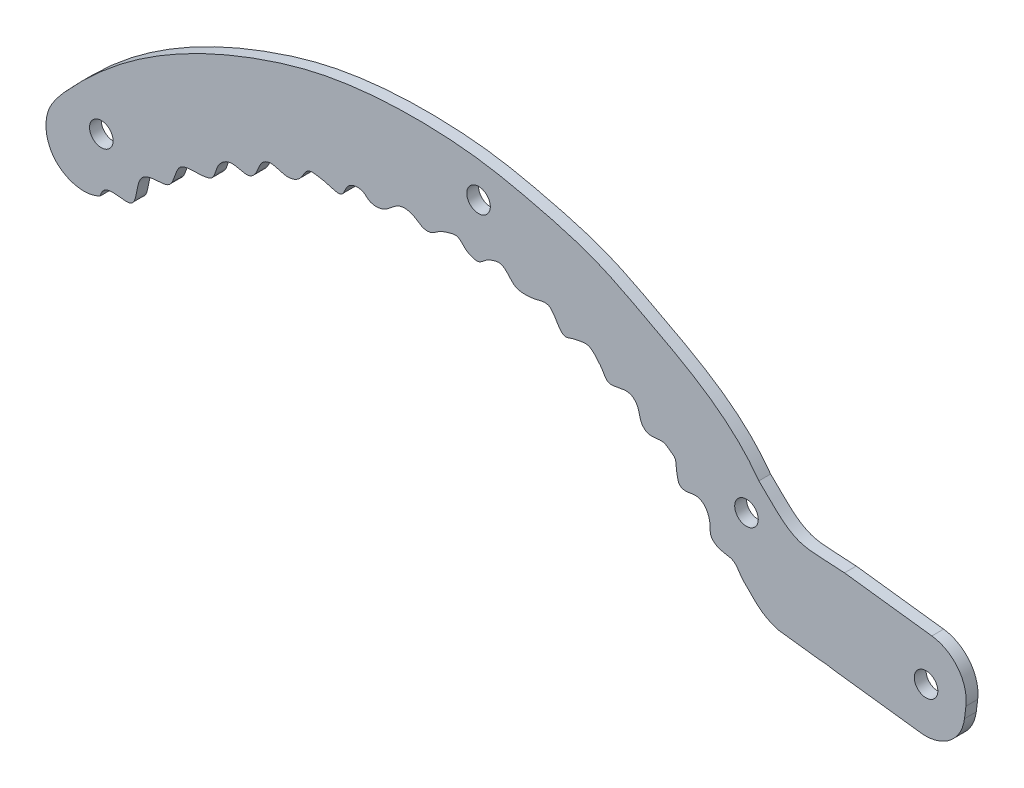
ISO-10303-21;
HEADER;
FILE_DESCRIPTION(('STEP AP214'),'2;1');
FILE_NAME('part.step','',(''),(''),'','','');
FILE_SCHEMA(('AUTOMOTIVE_DESIGN { 1 0 10303 214 1 1 1 1 }'));
ENDSEC;
DATA;
#1=APPLICATION_CONTEXT('core data for automotive mechanical design processes');
#2=APPLICATION_PROTOCOL_DEFINITION('international standard','automotive_design',2000,#1);
#3=PRODUCT_CONTEXT('',#1,'mechanical');
#4=PRODUCT('Part','Part','',(#3));
#5=PRODUCT_RELATED_PRODUCT_CATEGORY('part','',(#4));
#6=PRODUCT_DEFINITION_FORMATION('','',#4);
#7=PRODUCT_DEFINITION_CONTEXT('part definition',#1,'design');
#8=PRODUCT_DEFINITION('design','',#6,#7);
#9=PRODUCT_DEFINITION_SHAPE('','',#8);
#10=(LENGTH_UNIT() NAMED_UNIT(*) SI_UNIT(.MILLI.,.METRE.));
#11=(NAMED_UNIT(*) PLANE_ANGLE_UNIT() SI_UNIT($,.RADIAN.));
#12=(NAMED_UNIT(*) SI_UNIT($,.STERADIAN.) SOLID_ANGLE_UNIT());
#13=UNCERTAINTY_MEASURE_WITH_UNIT(LENGTH_MEASURE(1.E-05),#10,'distance_accuracy_value','');
#14=(GEOMETRIC_REPRESENTATION_CONTEXT(3) GLOBAL_UNCERTAINTY_ASSIGNED_CONTEXT((#13)) GLOBAL_UNIT_ASSIGNED_CONTEXT((#10,
#11,#12)) REPRESENTATION_CONTEXT('',''));
#15=CARTESIAN_POINT('',(0.,0.,0.));
#16=DIRECTION('',(0.,0.,1.));
#17=DIRECTION('',(1.,0.,0.));
#18=AXIS2_PLACEMENT_3D('',#15,#16,#17);
#19=CARTESIAN_POINT('',(0.0998833490836737,-0.584575880557825,1.5));
#20=DIRECTION('',(0.,0.,1.));
#21=DIRECTION('',(1.,0.,0.));
#22=AXIS2_PLACEMENT_3D('',#19,#20,#21);
#23=PLANE('',#22);
#24=CARTESIAN_POINT('',(0.167304742514029,0.145501945602866,1.5));
#25=DIRECTION('',(0.,0.,1.));
#26=DIRECTION('',(1.,0.,0.));
#27=AXIS2_PLACEMENT_3D('',#24,#25,#26);
#28=CIRCLE('',#27,1.50000000000011);
#29=CARTESIAN_POINT('',(1.66730474251414,0.145501945602866,1.5));
#30=VERTEX_POINT('',#29);
#31=EDGE_CURVE('E257',#30,#30,#28,.T.);
#32=ORIENTED_EDGE('',*,*,#31,.F.);
#33=EDGE_LOOP('',(#32));
#34=FACE_BOUND('',#33,.T.);
#35=CARTESIAN_POINT('',(-104.906076676747,8.31156840031277,1.5));
#36=DIRECTION('',(0.,0.,1.));
#37=DIRECTION('',(1.,0.,0.));
#38=AXIS2_PLACEMENT_3D('',#35,#36,#37);
#39=CIRCLE('',#38,1.5);
#40=CARTESIAN_POINT('',(-103.406076676747,8.31156840031277,1.5));
#41=VERTEX_POINT('',#40);
#42=EDGE_CURVE('E249',#41,#41,#39,.T.);
#43=ORIENTED_EDGE('',*,*,#42,.F.);
#44=EDGE_LOOP('',(#43));
#45=FACE_BOUND('',#44,.T.);
#46=CARTESIAN_POINT('',(0.0998833490836737,-0.584575880557825,1.5));
#47=DIRECTION('',(0.,0.,1.));
#48=DIRECTION('',(1.,0.,0.));
#49=AXIS2_PLACEMENT_3D('',#46,#47,#48);
#50=CIRCLE('',#49,4.99999999999996);
#51=CARTESIAN_POINT('',(-0.520900423310055,-5.54588896359664,1.5));
#52=VERTEX_POINT('',#51);
#53=CARTESIAN_POINT('',(5.06119643212249,-1.20535965295171,1.5));
#54=VERTEX_POINT('',#53);
#55=EDGE_CURVE('E244',#52,#54,#50,.T.);
#56=ORIENTED_EDGE('',*,*,#55,.T.);
#57=DIRECTION('',(0.124156754478779,0.992262616607769,0.));
#58=VECTOR('',#57,1.);
#59=CARTESIAN_POINT('',(5.24548290276533,0.267460543848186,1.5));
#60=LINE('',#59,#58);
#61=CARTESIAN_POINT('',(5.24548290276529,0.26746054384819,1.5));
#62=VERTEX_POINT('',#61);
#63=EDGE_CURVE('E109',#54,#62,#60,.T.);
#64=ORIENTED_EDGE('',*,*,#63,.T.);
#65=CARTESIAN_POINT('',(0.28416981972651,0.888244316242071,1.5));
#66=DIRECTION('',(0.,0.,1.));
#67=DIRECTION('',(1.,0.,0.));
#68=AXIS2_PLACEMENT_3D('',#65,#66,#67);
#69=CIRCLE('',#68,4.99999999999994);
#70=CARTESIAN_POINT('',(0.904953592120313,5.84955739928082,1.5));
#71=VERTEX_POINT('',#70);
#72=EDGE_CURVE('E241',#62,#71,#69,.T.);
#73=ORIENTED_EDGE('',*,*,#72,.T.);
#74=DIRECTION('',(-0.992262616607771,0.124156754478763,0.));
#75=VECTOR('',#74,1.);
#76=CARTESIAN_POINT('',(-10.2280218707566,7.24256977123525,1.5));
#77=LINE('',#76,#75);
#78=CARTESIAN_POINT('',(-10.2280218707566,7.24256977123525,1.5));
#79=VERTEX_POINT('',#78);
#80=EDGE_CURVE('E236',#71,#79,#77,.T.);
#81=ORIENTED_EDGE('',*,*,#80,.T.);
#82=CARTESIAN_POINT('',(-10.2280218707566,7.24256977123525,1.5));
#83=CARTESIAN_POINT('',(-10.9118560941422,7.28099631081727,1.5));
#84=CARTESIAN_POINT('',(-12.8351292385516,7.45598323970137,1.5));
#85=CARTESIAN_POINT('',(-17.1579812525324,7.41320448844757,1.5));
#86=CARTESIAN_POINT('',(-19.6512095664311,10.6162494281615,1.5));
#87=CARTESIAN_POINT('',(-21.1308451157724,11.9335614122551,1.5));
#88=B_SPLINE_CURVE_WITH_KNOTS('',3,(#82,#83,#84,#85,#86,#87),.UNSPECIFIED.,.F.,.F.,(4,1,1,4),
(0.763961689474748,0.803221291532483,0.875531472054988,1.),.UNSPECIFIED.);
#89=CARTESIAN_POINT('',(-21.1308451157724,11.9335614122551,1.5));
#90=VERTEX_POINT('',#89);
#91=EDGE_CURVE('E228',#79,#90,#88,.T.);
#92=ORIENTED_EDGE('',*,*,#91,.T.);
#93=CARTESIAN_POINT('',(-21.1308451157724,11.9335614122551,1.5));
#94=CARTESIAN_POINT('',(-24.8609025909508,17.1629284677813,1.5));
#95=CARTESIAN_POINT('',(-32.1642526822957,20.8937409379163,1.5));
#96=CARTESIAN_POINT('',(-42.137002014777,26.2165933973467,1.5));
#97=CARTESIAN_POINT('',(-49.0452055041722,28.0556629414949,1.5));
#98=CARTESIAN_POINT('',(-55.8035266419385,29.535441398283,1.5));
#99=CARTESIAN_POINT('',(-61.9486021471023,30.1048022388868,1.5));
#100=CARTESIAN_POINT('',(-69.5291101922665,30.1082909351504,1.5));
#101=CARTESIAN_POINT('',(-77.0729402385325,29.0917441837769,1.5));
#102=CARTESIAN_POINT('',(-83.8842916647882,27.0298701290858,1.5));
#103=CARTESIAN_POINT('',(-91.4088722325952,24.1708837791464,1.5));
#104=CARTESIAN_POINT('',(-100.536470974001,19.2605370321017,1.5));
#105=CARTESIAN_POINT('',(-107.722268555437,12.8664320493643,1.5));
#106=CARTESIAN_POINT('',(-111.96420869325,7.87512578609387,1.5));
#107=CARTESIAN_POINT('',(-112.038713313323,4.67097585174367,1.5));
#108=CARTESIAN_POINT('',(-110.388332641949,1.23561784118587,1.5));
#109=CARTESIAN_POINT('',(-106.98872594061,0.360842509721987,1.5));
#110=CARTESIAN_POINT('',(-105.034557463494,1.41904876347668,1.5));
#111=B_SPLINE_CURVE_WITH_KNOTS('',3,(#93,#94,#95,#96,#97,#98,#99,#100,#101,#102,#103,#104,#105,
#106,#107,#108,#109,#110),.UNSPECIFIED.,.F.,.F.,(4,1,1,1,1,1,1,1,1,1,1,1,1,1,1,4),(0.,
0.162308773326712,0.214040794515801,0.297345887842816,0.3491544880349,0.396314502565913,
0.45953043380621,0.548645128958728,0.595484356958903,0.646703324821764,0.760819589852608,
0.864658635925295,0.902713076006373,0.926128155665857,0.944546811556018,1.),.UNSPECIFIED.);
#112=CARTESIAN_POINT('',(-105.034557463494,1.41904876347668,1.5));
#113=VERTEX_POINT('',#112);
#114=EDGE_CURVE('E224',#90,#113,#111,.T.);
#115=ORIENTED_EDGE('',*,*,#114,.T.);
#116=CARTESIAN_POINT('',(-105.034557463494,1.41904876347668,1.5));
#117=CARTESIAN_POINT('',(-104.537224229497,3.55669158626756,1.5));
#118=CARTESIAN_POINT('',(-99.9157249071784,0.726117709058255,1.5));
#119=CARTESIAN_POINT('',(-100.686268223857,6.33570510251896,1.5));
#120=CARTESIAN_POINT('',(-97.9919374373541,6.76317894457257,1.5));
#121=CARTESIAN_POINT('',(-95.6119589330189,6.78829357120356,1.5));
#122=CARTESIAN_POINT('',(-95.5062926005543,10.302247264551,1.5));
#123=CARTESIAN_POINT('',(-92.6858254937039,10.0410850872853,1.5));
#124=CARTESIAN_POINT('',(-90.471397969832,10.3471513350679,1.5));
#125=CARTESIAN_POINT('',(-90.2857166520663,12.3318084892364,1.5));
#126=CARTESIAN_POINT('',(-88.7205513522671,13.6367949271627,1.5));
#127=CARTESIAN_POINT('',(-87.1967269712032,13.2015240159715,1.5));
#128=CARTESIAN_POINT('',(-85.9730408481968,13.0037147553385,1.5));
#129=CARTESIAN_POINT('',(-84.9760945435787,13.9694421913611,1.5));
#130=CARTESIAN_POINT('',(-84.7929322359732,15.273476468758,1.5));
#131=CARTESIAN_POINT('',(-83.2755251056831,16.1679036522777,1.5));
#132=CARTESIAN_POINT('',(-82.0121374499485,15.4733792017719,1.5));
#133=CARTESIAN_POINT('',(-80.588349589733,15.4291577862662,1.5));
#134=CARTESIAN_POINT('',(-79.3284052395579,16.064966203458,1.5));
#135=CARTESIAN_POINT('',(-78.816979746935,17.6715862609035,1.5));
#136=CARTESIAN_POINT('',(-77.0777055573877,17.4724022297882,1.5));
#137=CARTESIAN_POINT('',(-75.8925888339906,17.1932627028198,1.5));
#138=CARTESIAN_POINT('',(-74.0767729989613,16.5834332082953,1.5));
#139=CARTESIAN_POINT('',(-73.6604267294814,18.884189540374,1.5));
#140=CARTESIAN_POINT('',(-71.8275442111824,18.9364550204837,1.5));
#141=CARTESIAN_POINT('',(-71.2073844669563,18.3754270748762,1.5));
#142=B_SPLINE_CURVE_WITH_KNOTS('',3,(#116,#117,#118,#119,#120,#121,#122,#123,#124,#125,#126,
#127,#128,#129,#130,#131,#132,#133,#134,#135,#136,#137,#138,#139,#140,#141),.UNSPECIFIED.,.F.,
.F.,(4,1,1,1,1,1,1,1,1,1,1,1,1,1,1,1,1,1,1,1,1,1,1,4),(0.,0.10033187251802,0.186040251980362,
0.234954160897993,0.27030048666237,0.337741821565506,0.401919809800173,0.438279807635281,
0.476829940838354,0.523229195146984,0.559516768423253,0.584172910344551,0.604077360684183,
0.648703102907347,0.670042470876268,0.715950186250387,0.738312733574355,0.768610762270448,
0.808997732952222,0.834826143984133,0.875875240279468,0.90640030465833,0.941714400143514,1.),.UNSPECIFIED.);
#143=CARTESIAN_POINT('',(-71.2073844669563,18.3754270748762,1.5));
#144=VERTEX_POINT('',#143);
#145=EDGE_CURVE('E201',#113,#144,#142,.T.);
#146=ORIENTED_EDGE('',*,*,#145,.T.);
#147=CARTESIAN_POINT('',(-71.2073844669563,18.3754270748762,1.5));
#148=CARTESIAN_POINT('',(-70.5613918676471,17.6709819751456,1.5));
#149=CARTESIAN_POINT('',(-68.6315763360129,17.7282743174473,1.5));
#150=CARTESIAN_POINT('',(-67.4143548776561,19.3566910527241,1.5));
#151=CARTESIAN_POINT('',(-65.8931003891826,19.5413334752333,1.5));
#152=CARTESIAN_POINT('',(-64.8298613937313,19.0779979906913,1.5));
#153=CARTESIAN_POINT('',(-63.9004613568731,18.3417093996062,1.5));
#154=CARTESIAN_POINT('',(-62.7356424843646,18.376265097539,1.5));
#155=CARTESIAN_POINT('',(-61.9137797866602,19.1601345805774,1.5));
#156=CARTESIAN_POINT('',(-60.7965047785373,19.5093501232739,1.5));
#157=CARTESIAN_POINT('',(-59.4523948152849,19.9479952330147,1.5));
#158=CARTESIAN_POINT('',(-58.6621096256799,18.8662067907849,1.5));
#159=CARTESIAN_POINT('',(-57.8014956433852,18.3678918521534,1.5));
#160=CARTESIAN_POINT('',(-56.7225776710741,18.0970757095576,1.5));
#161=CARTESIAN_POINT('',(-55.975993865832,18.9428155183121,1.5));
#162=CARTESIAN_POINT('',(-55.0483108289275,19.3272482212001,1.5));
#163=CARTESIAN_POINT('',(-53.9885984907641,19.6034877427839,1.5));
#164=CARTESIAN_POINT('',(-53.0369585972021,18.7817379490643,1.5));
#165=CARTESIAN_POINT('',(-52.2572413971558,17.7013657901482,1.5));
#166=CARTESIAN_POINT('',(-50.7674194402618,17.5619046027108,1.5));
#167=CARTESIAN_POINT('',(-49.1702480464506,17.7658245803562,1.5));
#168=CARTESIAN_POINT('',(-47.9220114760856,18.2640607755011,1.5));
#169=CARTESIAN_POINT('',(-47.403001964652,17.3760208853382,1.5));
#170=B_SPLINE_CURVE_WITH_KNOTS('',3,(#147,#148,#149,#150,#151,#152,#153,#154,#155,#156,#157,
#158,#159,#160,#161,#162,#163,#164,#165,#166,#167,#168,#169),.UNSPECIFIED.,.F.,.F.,(4,1,1,1,1,1,
1,1,1,1,1,1,1,1,1,1,1,1,1,1,4),(0.,0.101433112648439,0.182304189498544,0.213922122931523,
0.268056795835965,0.309965908906496,0.345937919861134,0.389140378033071,0.432998877346524,
0.482664358285046,0.529097115106778,0.566719549823674,0.598853251916691,0.64417277734227,
0.680167064302808,0.715860802220602,0.759457234327231,0.810995739914042,0.863337515382828,
0.916048189125692,1.),.UNSPECIFIED.);
#171=CARTESIAN_POINT('',(-47.403001964652,17.3760208853382,1.5));
#172=VERTEX_POINT('',#171);
#173=EDGE_CURVE('E193',#144,#172,#170,.T.);
#174=ORIENTED_EDGE('',*,*,#173,.T.);
#175=CARTESIAN_POINT('',(-47.403001964652,17.3760208853382,1.5));
#176=CARTESIAN_POINT('',(-47.0506307001681,17.153358682594,1.5));
#177=CARTESIAN_POINT('',(-46.3423896365638,15.0704318426503,1.5));
#178=CARTESIAN_POINT('',(-44.96147882375,15.7969376391682,1.5));
#179=CARTESIAN_POINT('',(-44.0799558458357,15.8855546391553,1.5));
#180=CARTESIAN_POINT('',(-43.2019277573905,16.163418929188,1.5));
#181=CARTESIAN_POINT('',(-42.3797529941203,15.7872886403359,1.5));
#182=CARTESIAN_POINT('',(-41.7087496655523,15.0408890105356,1.5));
#183=CARTESIAN_POINT('',(-41.0332960549497,14.2657011141349,1.5));
#184=CARTESIAN_POINT('',(-40.4097104977028,12.9401361481689,1.5));
#185=CARTESIAN_POINT('',(-38.8586895413404,13.3590221092157,1.5));
#186=CARTESIAN_POINT('',(-37.3991245211734,13.5181692114874,1.5));
#187=CARTESIAN_POINT('',(-36.1933303860559,12.1204188998762,1.5));
#188=CARTESIAN_POINT('',(-36.3621867054558,10.8797532193114,1.5));
#189=CARTESIAN_POINT('',(-35.6593924754244,10.3528123927613,1.5));
#190=B_SPLINE_CURVE_WITH_KNOTS('',3,(#175,#176,#177,#178,#179,#180,#181,#182,#183,#184,#185,
#186,#187,#188,#189),.UNSPECIFIED.,.F.,.F.,(4,1,1,1,1,1,1,1,1,1,1,1,4),(0.,0.161236224841132,
0.21234834378781,0.265446348457359,0.336192935648755,0.378687986034091,0.4306367840808,
0.526782427636082,0.583170289821279,0.682556586618731,0.781270877614231,0.853713789343026,1.),.UNSPECIFIED.);
#191=CARTESIAN_POINT('',(-35.6593924754244,10.3528123927613,1.5));
#192=VERTEX_POINT('',#191);
#193=EDGE_CURVE('E185',#172,#192,#190,.T.);
#194=ORIENTED_EDGE('',*,*,#193,.T.);
#195=CARTESIAN_POINT('',(-35.6593924754244,10.3528123927613,1.5));
#196=CARTESIAN_POINT('',(-34.9394985510857,9.69165785970585,1.5));
#197=CARTESIAN_POINT('',(-33.5153642281029,10.5785046411633,1.5));
#198=CARTESIAN_POINT('',(-32.4687340437926,9.57942570770437,1.5));
#199=CARTESIAN_POINT('',(-31.7058784801425,9.17429137762466,1.5));
#200=CARTESIAN_POINT('',(-31.6927706227804,8.12022844425364,1.5));
#201=CARTESIAN_POINT('',(-31.53493530443,7.27633832784716,1.5));
#202=CARTESIAN_POINT('',(-31.3113393303147,6.34090361144915,1.5));
#203=CARTESIAN_POINT('',(-30.3092701086102,6.01678342442247,1.5));
#204=CARTESIAN_POINT('',(-29.3559806741296,6.42778952690004,1.5));
#205=CARTESIAN_POINT('',(-28.2336612151277,6.05935404872365,1.5));
#206=CARTESIAN_POINT('',(-27.5751389763181,5.14892812794407,1.5));
#207=CARTESIAN_POINT('',(-27.2848310567805,4.01906818431455,1.5));
#208=CARTESIAN_POINT('',(-27.4028309962669,2.90100800244214,1.5));
#209=CARTESIAN_POINT('',(-26.7244917228668,2.14354075737275,1.5));
#210=CARTESIAN_POINT('',(-25.6990407025661,1.73988482458814,1.5));
#211=CARTESIAN_POINT('',(-24.1441093963903,1.69684255123997,1.5));
#212=CARTESIAN_POINT('',(-23.5045169311268,0.303214670800772,1.5));
#213=CARTESIAN_POINT('',(-22.3178932877178,-0.867353105293234,1.5));
#214=CARTESIAN_POINT('',(-21.1399417809823,-2.16099565777622,1.5));
#215=CARTESIAN_POINT('',(-19.6787014006547,-2.94530161961282,1.5));
#216=CARTESIAN_POINT('',(-18.9279265745669,-3.20786045274996,1.5));
#217=CARTESIAN_POINT('',(-18.7413142605949,-3.26606161805892,1.5));
#218=B_SPLINE_CURVE_WITH_KNOTS('',3,(#195,#196,#197,#198,#199,#200,#201,#202,#203,#204,#205,
#206,#207,#208,#209,#210,#211,#212,#213,#214,#215,#216,#217),.UNSPECIFIED.,.F.,.F.,(4,1,1,1,1,1,
1,1,1,1,1,1,1,1,1,1,1,1,1,1,4),(0.,0.0360977535232211,0.0479926916056579,0.0581817737763515,
0.0697347680121679,0.0877085924399377,0.0966984007408338,0.107023851289053,0.126400839421723,
0.138602891285937,0.153227265236612,0.171393147328841,0.187122158128167,0.197485969105478,
0.21117177381614,0.233173167270583,0.256561051490695,0.268556148032797,0.303731537550353,
0.328871742898685,0.337069791489782),.UNSPECIFIED.);
#219=CARTESIAN_POINT('',(-18.7413142605949,-3.26606161805892,1.5));
#220=VERTEX_POINT('',#219);
#221=EDGE_CURVE('E143',#192,#220,#218,.T.);
#222=ORIENTED_EDGE('',*,*,#221,.T.);
#223=DIRECTION('',(0.992262616607769,-0.124156754478777,0.));
#224=VECTOR('',#223,1.);
#225=CARTESIAN_POINT('',(-13.7039615583219,-3.89635983973055,1.5));
#226=LINE('',#225,#224);
#227=CARTESIAN_POINT('',(-13.7039615583219,-3.89635983973055,1.5));
#228=VERTEX_POINT('',#227);
#229=EDGE_CURVE('E137',#220,#228,#226,.T.);
#230=ORIENTED_EDGE('',*,*,#229,.T.);
#231=CARTESIAN_POINT('',(-13.7039615583219,-3.89635983973055,1.5));
#232=CARTESIAN_POINT('',(-12.9336004270252,-3.94703594351054,1.5));
#233=CARTESIAN_POINT('',(-12.1667261402867,-4.02153656745583,1.5));
#234=CARTESIAN_POINT('',(-11.4028055289548,-4.18429174341576,1.5));
#235=B_SPLINE_CURVE_WITH_KNOTS('',3,(#231,#232,#233,#234),.UNSPECIFIED.,.F.,.F.,(4,4),
(0.407976375507315,0.440424774792505),.UNSPECIFIED.);
#236=CARTESIAN_POINT('',(-11.4028055289548,-4.18429174341575,1.5));
#237=VERTEX_POINT('',#236);
#238=EDGE_CURVE('E141',#228,#237,#235,.T.);
#239=ORIENTED_EDGE('',*,*,#238,.T.);
#240=DIRECTION('',(0.992262616607773,-0.124156754478747,0.));
#241=VECTOR('',#240,1.);
#242=CARTESIAN_POINT('',(-0.520900423310055,-5.54588896359664,1.5));
#243=LINE('',#242,#241);
#244=EDGE_CURVE('E51',#237,#52,#243,.T.);
#245=ORIENTED_EDGE('',*,*,#244,.T.);
#246=EDGE_LOOP('',(#56,#64,#73,#81,#92,#115,#146,#174,#194,#222,#230,#239,#245));
#247=FACE_BOUND('',#246,.T.);
#248=CARTESIAN_POINT('',(-22.7093395091616,7.63415942393245,1.5));
#249=DIRECTION('',(0.,0.,1.));
#250=DIRECTION('',(1.,0.,0.));
#251=AXIS2_PLACEMENT_3D('',#248,#249,#250);
#252=CIRCLE('',#251,1.50000000000011);
#253=CARTESIAN_POINT('',(-21.2093395091615,7.63415942393245,1.5));
#254=VERTEX_POINT('',#253);
#255=EDGE_CURVE('E250',#254,#254,#252,.T.);
#256=ORIENTED_EDGE('',*,*,#255,.F.);
#257=EDGE_LOOP('',(#256));
#258=FACE_BOUND('',#257,.T.);
#259=CARTESIAN_POINT('',(-56.8471646127496,25.0725255881413,1.5));
#260=DIRECTION('',(0.,0.,1.));
#261=DIRECTION('',(1.,0.,0.));
#262=AXIS2_PLACEMENT_3D('',#259,#260,#261);
#263=CIRCLE('',#262,1.50000000000011);
#264=CARTESIAN_POINT('',(-55.3471646127495,25.0725255881413,1.5));
#265=VERTEX_POINT('',#264);
#266=EDGE_CURVE('E263',#265,#265,#263,.T.);
#267=ORIENTED_EDGE('',*,*,#266,.F.);
#268=EDGE_LOOP('',(#267));
#269=FACE_BOUND('',#268,.T.);
#270=ADVANCED_FACE('F34',(#34,#45,#247,#258,#269),#23,.T.);
#271=CARTESIAN_POINT('',(0.0998833490836737,-0.584575880557825,0.));
#272=DIRECTION('',(0.,0.,1.));
#273=DIRECTION('',(1.,0.,0.));
#274=AXIS2_PLACEMENT_3D('',#271,#272,#273);
#275=PLANE('',#274);
#276=CARTESIAN_POINT('',(0.167304742514029,0.145501945602866,0.));
#277=DIRECTION('',(0.,0.,1.));
#278=DIRECTION('',(1.,0.,0.));
#279=AXIS2_PLACEMENT_3D('',#276,#277,#278);
#280=CIRCLE('',#279,1.50000000000011);
#281=CARTESIAN_POINT('',(1.66730474251414,0.145501945602866,0.));
#282=VERTEX_POINT('',#281);
#283=EDGE_CURVE('E260',#282,#282,#280,.T.);
#284=ORIENTED_EDGE('',*,*,#283,.T.);
#285=EDGE_LOOP('',(#284));
#286=FACE_BOUND('',#285,.T.);
#287=CARTESIAN_POINT('',(-104.906076676747,8.31156840031277,0.));
#288=DIRECTION('',(0.,0.,1.));
#289=DIRECTION('',(1.,0.,0.));
#290=AXIS2_PLACEMENT_3D('',#287,#288,#289);
#291=CIRCLE('',#290,1.5);
#292=CARTESIAN_POINT('',(-103.406076676747,8.31156840031277,0.));
#293=VERTEX_POINT('',#292);
#294=EDGE_CURVE('E246',#293,#293,#291,.T.);
#295=ORIENTED_EDGE('',*,*,#294,.T.);
#296=EDGE_LOOP('',(#295));
#297=FACE_BOUND('',#296,.T.);
#298=CARTESIAN_POINT('',(0.0998833490836737,-0.584575880557825,0.));
#299=DIRECTION('',(0.,0.,1.));
#300=DIRECTION('',(1.,0.,0.));
#301=AXIS2_PLACEMENT_3D('',#298,#299,#300);
#302=CIRCLE('',#301,4.99999999999996);
#303=CARTESIAN_POINT('',(-0.520900423310055,-5.54588896359664,0.));
#304=VERTEX_POINT('',#303);
#305=CARTESIAN_POINT('',(5.06119643212249,-1.20535965295171,0.));
#306=VERTEX_POINT('',#305);
#307=EDGE_CURVE('E253',#304,#306,#302,.T.);
#308=ORIENTED_EDGE('',*,*,#307,.F.);
#309=DIRECTION('',(0.992262616607773,-0.124156754478747,0.));
#310=VECTOR('',#309,1.);
#311=CARTESIAN_POINT('',(-0.520900423310055,-5.54588896359664,0.));
#312=LINE('',#311,#310);
#313=CARTESIAN_POINT('',(-11.4028055289548,-4.18429174341575,0.));
#314=VERTEX_POINT('',#313);
#315=EDGE_CURVE('E101',#314,#304,#312,.T.);
#316=ORIENTED_EDGE('',*,*,#315,.F.);
#317=CARTESIAN_POINT('',(-13.7039615583219,-3.89635983973055,0.));
#318=CARTESIAN_POINT('',(-12.9336004270252,-3.94703594351054,0.));
#319=CARTESIAN_POINT('',(-12.1667261402867,-4.02153656745583,0.));
#320=CARTESIAN_POINT('',(-11.4028055289548,-4.18429174341576,0.));
#321=B_SPLINE_CURVE_WITH_KNOTS('',3,(#317,#318,#319,#320),.UNSPECIFIED.,.F.,.F.,(4,4),
(0.407976375507315,0.440424774792505),.UNSPECIFIED.);
#322=CARTESIAN_POINT('',(-13.7039615583219,-3.89635983973055,0.));
#323=VERTEX_POINT('',#322);
#324=EDGE_CURVE('E95',#323,#314,#321,.T.);
#325=ORIENTED_EDGE('',*,*,#324,.F.);
#326=DIRECTION('',(0.992262616607769,-0.124156754478777,0.));
#327=VECTOR('',#326,1.);
#328=CARTESIAN_POINT('',(-13.7039615583219,-3.89635983973055,0.));
#329=LINE('',#328,#327);
#330=CARTESIAN_POINT('',(-18.7413142605949,-3.26606161805892,0.));
#331=VERTEX_POINT('',#330);
#332=EDGE_CURVE('E151',#331,#323,#329,.T.);
#333=ORIENTED_EDGE('',*,*,#332,.F.);
#334=CARTESIAN_POINT('',(-35.6593924754244,10.3528123927613,0.));
#335=CARTESIAN_POINT('',(-34.9394985510857,9.69165785970585,0.));
#336=CARTESIAN_POINT('',(-33.5153642281029,10.5785046411633,0.));
#337=CARTESIAN_POINT('',(-32.4687340437926,9.57942570770437,0.));
#338=CARTESIAN_POINT('',(-31.7058784801425,9.17429137762466,0.));
#339=CARTESIAN_POINT('',(-31.6927706227804,8.12022844425364,0.));
#340=CARTESIAN_POINT('',(-31.53493530443,7.27633832784716,0.));
#341=CARTESIAN_POINT('',(-31.3113393303147,6.34090361144915,0.));
#342=CARTESIAN_POINT('',(-30.3092701086102,6.01678342442247,0.));
#343=CARTESIAN_POINT('',(-29.3559806741296,6.42778952690004,0.));
#344=CARTESIAN_POINT('',(-28.2336612151277,6.05935404872365,0.));
#345=CARTESIAN_POINT('',(-27.5751389763181,5.14892812794407,0.));
#346=CARTESIAN_POINT('',(-27.2848310567805,4.01906818431455,0.));
#347=CARTESIAN_POINT('',(-27.4028309962669,2.90100800244214,0.));
#348=CARTESIAN_POINT('',(-26.7244917228668,2.14354075737275,0.));
#349=CARTESIAN_POINT('',(-25.6990407025661,1.73988482458814,0.));
#350=CARTESIAN_POINT('',(-24.1441093963903,1.69684255123997,0.));
#351=CARTESIAN_POINT('',(-23.5045169311268,0.303214670800772,0.));
#352=CARTESIAN_POINT('',(-22.3178932877178,-0.867353105293234,0.));
#353=CARTESIAN_POINT('',(-21.1399417809823,-2.16099565777622,0.));
#354=CARTESIAN_POINT('',(-19.6787014006547,-2.94530161961282,0.));
#355=CARTESIAN_POINT('',(-18.9279265745669,-3.20786045274996,0.));
#356=CARTESIAN_POINT('',(-18.7413142605949,-3.26606161805892,0.));
#357=B_SPLINE_CURVE_WITH_KNOTS('',3,(#334,#335,#336,#337,#338,#339,#340,#341,#342,#343,#344,
#345,#346,#347,#348,#349,#350,#351,#352,#353,#354,#355,#356),.UNSPECIFIED.,.F.,.F.,(4,1,1,1,1,1,
1,1,1,1,1,1,1,1,1,1,1,1,1,1,4),(0.,0.0360977535232211,0.0479926916056579,0.0581817737763515,
0.0697347680121679,0.0877085924399377,0.0966984007408338,0.107023851289053,0.126400839421723,
0.138602891285937,0.153227265236612,0.171393147328841,0.187122158128167,0.197485969105478,
0.21117177381614,0.233173167270583,0.256561051490695,0.268556148032797,0.303731537550353,
0.328871742898685,0.337069791489782),.UNSPECIFIED.);
#358=CARTESIAN_POINT('',(-35.6593924754244,10.3528123927613,0.));
#359=VERTEX_POINT('',#358);
#360=EDGE_CURVE('E471',#359,#331,#357,.T.);
#361=ORIENTED_EDGE('',*,*,#360,.F.);
#362=CARTESIAN_POINT('',(-47.403001964652,17.3760208853382,0.));
#363=CARTESIAN_POINT('',(-47.0506307001681,17.153358682594,0.));
#364=CARTESIAN_POINT('',(-46.3423896365638,15.0704318426503,0.));
#365=CARTESIAN_POINT('',(-44.96147882375,15.7969376391682,0.));
#366=CARTESIAN_POINT('',(-44.0799558458357,15.8855546391553,0.));
#367=CARTESIAN_POINT('',(-43.2019277573905,16.163418929188,0.));
#368=CARTESIAN_POINT('',(-42.3797529941203,15.7872886403359,0.));
#369=CARTESIAN_POINT('',(-41.7087496655523,15.0408890105356,0.));
#370=CARTESIAN_POINT('',(-41.0332960549497,14.2657011141349,0.));
#371=CARTESIAN_POINT('',(-40.4097104977028,12.9401361481689,0.));
#372=CARTESIAN_POINT('',(-38.8586895413404,13.3590221092157,0.));
#373=CARTESIAN_POINT('',(-37.3991245211734,13.5181692114874,0.));
#374=CARTESIAN_POINT('',(-36.1933303860559,12.1204188998762,0.));
#375=CARTESIAN_POINT('',(-36.3621867054558,10.8797532193114,0.));
#376=CARTESIAN_POINT('',(-35.6593924754244,10.3528123927613,0.));
#377=B_SPLINE_CURVE_WITH_KNOTS('',3,(#362,#363,#364,#365,#366,#367,#368,#369,#370,#371,#372,
#373,#374,#375,#376),.UNSPECIFIED.,.F.,.F.,(4,1,1,1,1,1,1,1,1,1,1,1,4),(0.,0.161236224841132,
0.21234834378781,0.265446348457359,0.336192935648755,0.378687986034091,0.4306367840808,
0.526782427636082,0.583170289821279,0.682556586618731,0.781270877614231,0.853713789343026,1.),.UNSPECIFIED.);
#378=CARTESIAN_POINT('',(-47.403001964652,17.3760208853382,0.));
#379=VERTEX_POINT('',#378);
#380=EDGE_CURVE('E464',#379,#359,#377,.T.);
#381=ORIENTED_EDGE('',*,*,#380,.F.);
#382=CARTESIAN_POINT('',(-71.2073844669563,18.3754270748762,0.));
#383=CARTESIAN_POINT('',(-70.5613918676471,17.6709819751456,0.));
#384=CARTESIAN_POINT('',(-68.6315763360129,17.7282743174473,0.));
#385=CARTESIAN_POINT('',(-67.4143548776561,19.3566910527241,0.));
#386=CARTESIAN_POINT('',(-65.8931003891826,19.5413334752333,0.));
#387=CARTESIAN_POINT('',(-64.8298613937313,19.0779979906913,0.));
#388=CARTESIAN_POINT('',(-63.9004613568731,18.3417093996062,0.));
#389=CARTESIAN_POINT('',(-62.7356424843646,18.376265097539,0.));
#390=CARTESIAN_POINT('',(-61.9137797866602,19.1601345805774,0.));
#391=CARTESIAN_POINT('',(-60.7965047785373,19.5093501232739,0.));
#392=CARTESIAN_POINT('',(-59.4523948152849,19.9479952330147,0.));
#393=CARTESIAN_POINT('',(-58.6621096256799,18.8662067907849,0.));
#394=CARTESIAN_POINT('',(-57.8014956433852,18.3678918521534,0.));
#395=CARTESIAN_POINT('',(-56.7225776710741,18.0970757095576,0.));
#396=CARTESIAN_POINT('',(-55.975993865832,18.9428155183121,0.));
#397=CARTESIAN_POINT('',(-55.0483108289275,19.3272482212001,0.));
#398=CARTESIAN_POINT('',(-53.9885984907641,19.6034877427839,0.));
#399=CARTESIAN_POINT('',(-53.0369585972021,18.7817379490643,0.));
#400=CARTESIAN_POINT('',(-52.2572413971558,17.7013657901482,0.));
#401=CARTESIAN_POINT('',(-50.7674194402618,17.5619046027108,0.));
#402=CARTESIAN_POINT('',(-49.1702480464506,17.7658245803562,0.));
#403=CARTESIAN_POINT('',(-47.9220114760856,18.2640607755011,0.));
#404=CARTESIAN_POINT('',(-47.403001964652,17.3760208853382,0.));
#405=B_SPLINE_CURVE_WITH_KNOTS('',3,(#382,#383,#384,#385,#386,#387,#388,#389,#390,#391,#392,
#393,#394,#395,#396,#397,#398,#399,#400,#401,#402,#403,#404),.UNSPECIFIED.,.F.,.F.,(4,1,1,1,1,1,
1,1,1,1,1,1,1,1,1,1,1,1,1,1,4),(0.,0.101433112648439,0.182304189498544,0.213922122931523,
0.268056795835965,0.309965908906496,0.345937919861134,0.389140378033071,0.432998877346524,
0.482664358285046,0.529097115106778,0.566719549823674,0.598853251916691,0.64417277734227,
0.680167064302808,0.715860802220602,0.759457234327231,0.810995739914042,0.863337515382828,
0.916048189125692,1.),.UNSPECIFIED.);
#406=CARTESIAN_POINT('',(-71.2073844669563,18.3754270748762,0.));
#407=VERTEX_POINT('',#406);
#408=EDGE_CURVE('E457',#407,#379,#405,.T.);
#409=ORIENTED_EDGE('',*,*,#408,.F.);
#410=CARTESIAN_POINT('',(-105.034557463494,1.41904876347668,0.));
#411=CARTESIAN_POINT('',(-104.537224229497,3.55669158626756,0.));
#412=CARTESIAN_POINT('',(-99.9157249071784,0.726117709058255,0.));
#413=CARTESIAN_POINT('',(-100.686268223857,6.33570510251896,0.));
#414=CARTESIAN_POINT('',(-97.9919374373541,6.76317894457257,0.));
#415=CARTESIAN_POINT('',(-95.6119589330189,6.78829357120356,0.));
#416=CARTESIAN_POINT('',(-95.5062926005543,10.302247264551,0.));
#417=CARTESIAN_POINT('',(-92.6858254937039,10.0410850872853,0.));
#418=CARTESIAN_POINT('',(-90.471397969832,10.3471513350679,0.));
#419=CARTESIAN_POINT('',(-90.2857166520663,12.3318084892364,0.));
#420=CARTESIAN_POINT('',(-88.7205513522671,13.6367949271627,0.));
#421=CARTESIAN_POINT('',(-87.1967269712032,13.2015240159715,0.));
#422=CARTESIAN_POINT('',(-85.9730408481968,13.0037147553385,0.));
#423=CARTESIAN_POINT('',(-84.9760945435787,13.9694421913611,0.));
#424=CARTESIAN_POINT('',(-84.7929322359732,15.273476468758,0.));
#425=CARTESIAN_POINT('',(-83.2755251056831,16.1679036522777,0.));
#426=CARTESIAN_POINT('',(-82.0121374499485,15.4733792017719,0.));
#427=CARTESIAN_POINT('',(-80.588349589733,15.4291577862662,0.));
#428=CARTESIAN_POINT('',(-79.3284052395579,16.064966203458,0.));
#429=CARTESIAN_POINT('',(-78.816979746935,17.6715862609035,0.));
#430=CARTESIAN_POINT('',(-77.0777055573877,17.4724022297882,0.));
#431=CARTESIAN_POINT('',(-75.8925888339906,17.1932627028198,0.));
#432=CARTESIAN_POINT('',(-74.0767729989613,16.5834332082953,0.));
#433=CARTESIAN_POINT('',(-73.6604267294814,18.884189540374,0.));
#434=CARTESIAN_POINT('',(-71.8275442111824,18.9364550204837,0.));
#435=CARTESIAN_POINT('',(-71.2073844669563,18.3754270748762,0.));
#436=B_SPLINE_CURVE_WITH_KNOTS('',3,(#410,#411,#412,#413,#414,#415,#416,#417,#418,#419,#420,
#421,#422,#423,#424,#425,#426,#427,#428,#429,#430,#431,#432,#433,#434,#435),.UNSPECIFIED.,.F.,
.F.,(4,1,1,1,1,1,1,1,1,1,1,1,1,1,1,1,1,1,1,1,1,1,1,4),(0.,0.10033187251802,0.186040251980362,
0.234954160897993,0.27030048666237,0.337741821565506,0.401919809800173,0.438279807635281,
0.476829940838354,0.523229195146984,0.559516768423253,0.584172910344551,0.604077360684183,
0.648703102907347,0.670042470876268,0.715950186250387,0.738312733574355,0.768610762270448,
0.808997732952222,0.834826143984133,0.875875240279468,0.90640030465833,0.941714400143514,1.),.UNSPECIFIED.);
#437=CARTESIAN_POINT('',(-105.034557463494,1.41904876347668,0.));
#438=VERTEX_POINT('',#437);
#439=EDGE_CURVE('E450',#438,#407,#436,.T.);
#440=ORIENTED_EDGE('',*,*,#439,.F.);
#441=CARTESIAN_POINT('',(-21.1308451157724,11.9335614122551,0.));
#442=CARTESIAN_POINT('',(-24.8609025909508,17.1629284677813,0.));
#443=CARTESIAN_POINT('',(-32.1642526822957,20.8937409379163,0.));
#444=CARTESIAN_POINT('',(-42.137002014777,26.2165933973467,0.));
#445=CARTESIAN_POINT('',(-49.0452055041722,28.0556629414949,0.));
#446=CARTESIAN_POINT('',(-55.8035266419385,29.535441398283,0.));
#447=CARTESIAN_POINT('',(-61.9486021471023,30.1048022388868,0.));
#448=CARTESIAN_POINT('',(-69.5291101922665,30.1082909351504,0.));
#449=CARTESIAN_POINT('',(-77.0729402385325,29.0917441837769,0.));
#450=CARTESIAN_POINT('',(-83.8842916647882,27.0298701290858,0.));
#451=CARTESIAN_POINT('',(-91.4088722325952,24.1708837791464,0.));
#452=CARTESIAN_POINT('',(-100.536470974001,19.2605370321017,0.));
#453=CARTESIAN_POINT('',(-107.722268555437,12.8664320493643,0.));
#454=CARTESIAN_POINT('',(-111.96420869325,7.87512578609387,0.));
#455=CARTESIAN_POINT('',(-112.038713313323,4.67097585174367,0.));
#456=CARTESIAN_POINT('',(-110.388332641949,1.23561784118587,0.));
#457=CARTESIAN_POINT('',(-106.98872594061,0.360842509721987,0.));
#458=CARTESIAN_POINT('',(-105.034557463494,1.41904876347668,0.));
#459=B_SPLINE_CURVE_WITH_KNOTS('',3,(#441,#442,#443,#444,#445,#446,#447,#448,#449,#450,#451,
#452,#453,#454,#455,#456,#457,#458),.UNSPECIFIED.,.F.,.F.,(4,1,1,1,1,1,1,1,1,1,1,1,1,1,1,4),(0.,
0.162308773326712,0.214040794515801,0.297345887842816,0.3491544880349,0.396314502565913,
0.45953043380621,0.548645128958728,0.595484356958903,0.646703324821764,0.760819589852608,
0.864658635925295,0.902713076006373,0.926128155665857,0.944546811556018,1.),.UNSPECIFIED.);
#460=CARTESIAN_POINT('',(-21.1308451157724,11.9335614122551,0.));
#461=VERTEX_POINT('',#460);
#462=EDGE_CURVE('E443',#461,#438,#459,.T.);
#463=ORIENTED_EDGE('',*,*,#462,.F.);
#464=CARTESIAN_POINT('',(-10.2280218707566,7.24256977123525,0.));
#465=CARTESIAN_POINT('',(-10.9118560941422,7.28099631081727,0.));
#466=CARTESIAN_POINT('',(-12.8351292385516,7.45598323970137,0.));
#467=CARTESIAN_POINT('',(-17.1579812525324,7.41320448844757,0.));
#468=CARTESIAN_POINT('',(-19.6512095664311,10.6162494281615,0.));
#469=CARTESIAN_POINT('',(-21.1308451157724,11.9335614122551,0.));
#470=B_SPLINE_CURVE_WITH_KNOTS('',3,(#464,#465,#466,#467,#468,#469),.UNSPECIFIED.,.F.,.F.,(4,1,
1,4),(0.763961689474748,0.803221291532483,0.875531472054988,1.),.UNSPECIFIED.);
#471=CARTESIAN_POINT('',(-10.2280218707566,7.24256977123525,0.));
#472=VERTEX_POINT('',#471);
#473=EDGE_CURVE('E439',#472,#461,#470,.T.);
#474=ORIENTED_EDGE('',*,*,#473,.F.);
#475=DIRECTION('',(-0.992262616607771,0.124156754478763,0.));
#476=VECTOR('',#475,1.);
#477=CARTESIAN_POINT('',(-10.2280218707566,7.24256977123525,0.));
#478=LINE('',#477,#476);
#479=CARTESIAN_POINT('',(0.904953592120313,5.84955739928082,0.));
#480=VERTEX_POINT('',#479);
#481=EDGE_CURVE('E437',#480,#472,#478,.T.);
#482=ORIENTED_EDGE('',*,*,#481,.F.);
#483=CARTESIAN_POINT('',(0.28416981972651,0.888244316242071,0.));
#484=DIRECTION('',(0.,0.,1.));
#485=DIRECTION('',(1.,0.,0.));
#486=AXIS2_PLACEMENT_3D('',#483,#484,#485);
#487=CIRCLE('',#486,4.99999999999994);
#488=CARTESIAN_POINT('',(5.24548290276529,0.26746054384819,0.));
#489=VERTEX_POINT('',#488);
#490=EDGE_CURVE('E433',#489,#480,#487,.T.);
#491=ORIENTED_EDGE('',*,*,#490,.F.);
#492=DIRECTION('',(0.124156754478779,0.992262616607769,0.));
#493=VECTOR('',#492,1.);
#494=CARTESIAN_POINT('',(5.24548290276533,0.267460543848186,0.));
#495=LINE('',#494,#493);
#496=EDGE_CURVE('E432',#306,#489,#495,.T.);
#497=ORIENTED_EDGE('',*,*,#496,.F.);
#498=EDGE_LOOP('',(#308,#316,#325,#333,#361,#381,#409,#440,#463,#474,#482,#491,#497));
#499=FACE_BOUND('',#498,.T.);
#500=CARTESIAN_POINT('',(-22.7093395091616,7.63415942393245,0.));
#501=DIRECTION('',(0.,0.,1.));
#502=DIRECTION('',(1.,0.,0.));
#503=AXIS2_PLACEMENT_3D('',#500,#501,#502);
#504=CIRCLE('',#503,1.50000000000011);
#505=CARTESIAN_POINT('',(-21.2093395091615,7.63415942393245,0.));
#506=VERTEX_POINT('',#505);
#507=EDGE_CURVE('E254',#506,#506,#504,.T.);
#508=ORIENTED_EDGE('',*,*,#507,.T.);
#509=EDGE_LOOP('',(#508));
#510=FACE_BOUND('',#509,.T.);
#511=CARTESIAN_POINT('',(-56.8471646127496,25.0725255881413,0.));
#512=DIRECTION('',(0.,0.,1.));
#513=DIRECTION('',(1.,0.,0.));
#514=AXIS2_PLACEMENT_3D('',#511,#512,#513);
#515=CIRCLE('',#514,1.50000000000011);
#516=CARTESIAN_POINT('',(-55.3471646127495,25.0725255881413,0.));
#517=VERTEX_POINT('',#516);
#518=EDGE_CURVE('E266',#517,#517,#515,.T.);
#519=ORIENTED_EDGE('',*,*,#518,.T.);
#520=EDGE_LOOP('',(#519));
#521=FACE_BOUND('',#520,.T.);
#522=ADVANCED_FACE('F276',(#286,#297,#499,#510,#521),#275,.F.);
#523=CARTESIAN_POINT('',(0.0998833490836737,-0.584575880557825,1.5));
#524=DIRECTION('',(0.,0.,-1.));
#525=DIRECTION('',(-1.,0.,0.));
#526=AXIS2_PLACEMENT_3D('',#523,#524,#525);
#527=CYLINDRICAL_SURFACE('',#526,4.99999999999996);
#528=ORIENTED_EDGE('',*,*,#307,.T.);
#529=DIRECTION('',(0.,0.,-1.));
#530=VECTOR('',#529,1.);
#531=CARTESIAN_POINT('',(5.06119643212249,-1.20535965295171,1.5));
#532=LINE('',#531,#530);
#533=EDGE_CURVE('E11',#54,#306,#532,.T.);
#534=ORIENTED_EDGE('',*,*,#533,.F.);
#535=ORIENTED_EDGE('',*,*,#55,.F.);
#536=DIRECTION('',(0.,0.,-1.));
#537=VECTOR('',#536,1.);
#538=CARTESIAN_POINT('',(-0.520900423310055,-5.54588896359664,1.5));
#539=LINE('',#538,#537);
#540=EDGE_CURVE('E157',#52,#304,#539,.T.);
#541=ORIENTED_EDGE('',*,*,#540,.T.);
#542=EDGE_LOOP('',(#528,#534,#535,#541));
#543=FACE_BOUND('',#542,.T.);
#544=ADVANCED_FACE('F36',(#543),#527,.T.);
#545=CARTESIAN_POINT('',(5.24548290276533,0.267460543848186,1.5));
#546=DIRECTION('',(-0.992262616607769,0.124156754478779,0.));
#547=DIRECTION('',(-0.124156754478779,-0.992262616607769,0.));
#548=AXIS2_PLACEMENT_3D('',#545,#546,#547);
#549=PLANE('',#548);
#550=ORIENTED_EDGE('',*,*,#496,.T.);
#551=DIRECTION('',(0.,0.,-1.));
#552=VECTOR('',#551,1.);
#553=CARTESIAN_POINT('',(5.24548290276529,0.26746054384819,1.5));
#554=LINE('',#553,#552);
#555=EDGE_CURVE('E43',#62,#489,#554,.T.);
#556=ORIENTED_EDGE('',*,*,#555,.F.);
#557=ORIENTED_EDGE('',*,*,#63,.F.);
#558=ORIENTED_EDGE('',*,*,#533,.T.);
#559=EDGE_LOOP('',(#550,#556,#557,#558));
#560=FACE_BOUND('',#559,.T.);
#561=ADVANCED_FACE('F368',(#560),#549,.F.);
#562=CARTESIAN_POINT('',(0.28416981972651,0.888244316242071,1.5));
#563=DIRECTION('',(0.,0.,-1.));
#564=DIRECTION('',(-1.,0.,0.));
#565=AXIS2_PLACEMENT_3D('',#562,#563,#564);
#566=CYLINDRICAL_SURFACE('',#565,4.99999999999994);
#567=ORIENTED_EDGE('',*,*,#490,.T.);
#568=DIRECTION('',(0.,0.,-1.));
#569=VECTOR('',#568,1.);
#570=CARTESIAN_POINT('',(0.904953592120313,5.84955739928082,1.5));
#571=LINE('',#570,#569);
#572=EDGE_CURVE('E510',#71,#480,#571,.T.);
#573=ORIENTED_EDGE('',*,*,#572,.F.);
#574=ORIENTED_EDGE('',*,*,#72,.F.);
#575=ORIENTED_EDGE('',*,*,#555,.T.);
#576=EDGE_LOOP('',(#567,#573,#574,#575));
#577=FACE_BOUND('',#576,.T.);
#578=ADVANCED_FACE('F361',(#577),#566,.T.);
#579=CARTESIAN_POINT('',(-10.2280218707566,7.24256977123525,1.5));
#580=DIRECTION('',(-0.124156754478763,-0.992262616607771,0.));
#581=DIRECTION('',(0.992262616607771,-0.124156754478763,0.));
#582=AXIS2_PLACEMENT_3D('',#579,#580,#581);
#583=PLANE('',#582);
#584=ORIENTED_EDGE('',*,*,#481,.T.);
#585=DIRECTION('',(0.,0.,-1.));
#586=VECTOR('',#585,1.);
#587=CARTESIAN_POINT('',(-10.2280218707566,7.24256977123525,1.5));
#588=LINE('',#587,#586);
#589=EDGE_CURVE('E507',#79,#472,#588,.T.);
#590=ORIENTED_EDGE('',*,*,#589,.F.);
#591=ORIENTED_EDGE('',*,*,#80,.F.);
#592=ORIENTED_EDGE('',*,*,#572,.T.);
#593=EDGE_LOOP('',(#584,#590,#591,#592));
#594=FACE_BOUND('',#593,.T.);
#595=ADVANCED_FACE('F354',(#594),#583,.F.);
#596=DIRECTION('',(0.,0.,-1.));
#597=VECTOR('',#596,1.);
#598=SURFACE_OF_LINEAR_EXTRUSION('',#88,#597);
#599=ORIENTED_EDGE('',*,*,#473,.T.);
#600=DIRECTION('',(0.,0.,-1.));
#601=VECTOR('',#600,1.);
#602=CARTESIAN_POINT('',(-21.1308451157724,11.9335614122551,1.5));
#603=LINE('',#602,#601);
#604=EDGE_CURVE('E504',#90,#461,#603,.T.);
#605=ORIENTED_EDGE('',*,*,#604,.F.);
#606=ORIENTED_EDGE('',*,*,#91,.F.);
#607=ORIENTED_EDGE('',*,*,#589,.T.);
#608=EDGE_LOOP('',(#599,#605,#606,#607));
#609=FACE_BOUND('',#608,.T.);
#610=ADVANCED_FACE('F220',(#609),#598,.F.);
#611=DIRECTION('',(0.,0.,-1.));
#612=VECTOR('',#611,1.);
#613=SURFACE_OF_LINEAR_EXTRUSION('',#111,#612);
#614=ORIENTED_EDGE('',*,*,#462,.T.);
#615=DIRECTION('',(0.,0.,-1.));
#616=VECTOR('',#615,1.);
#617=CARTESIAN_POINT('',(-105.034557463494,1.41904876347668,1.5));
#618=LINE('',#617,#616);
#619=EDGE_CURVE('E501',#113,#438,#618,.T.);
#620=ORIENTED_EDGE('',*,*,#619,.F.);
#621=ORIENTED_EDGE('',*,*,#114,.F.);
#622=ORIENTED_EDGE('',*,*,#604,.T.);
#623=EDGE_LOOP('',(#614,#620,#621,#622));
#624=FACE_BOUND('',#623,.T.);
#625=ADVANCED_FACE('F216',(#624),#613,.F.);
#626=DIRECTION('',(0.,0.,-1.));
#627=VECTOR('',#626,1.);
#628=SURFACE_OF_LINEAR_EXTRUSION('',#142,#627);
#629=ORIENTED_EDGE('',*,*,#439,.T.);
#630=DIRECTION('',(0.,0.,-1.));
#631=VECTOR('',#630,1.);
#632=CARTESIAN_POINT('',(-71.2073844669563,18.3754270748762,1.5));
#633=LINE('',#632,#631);
#634=EDGE_CURVE('E498',#144,#407,#633,.T.);
#635=ORIENTED_EDGE('',*,*,#634,.F.);
#636=ORIENTED_EDGE('',*,*,#145,.F.);
#637=ORIENTED_EDGE('',*,*,#619,.T.);
#638=EDGE_LOOP('',(#629,#635,#636,#637));
#639=FACE_BOUND('',#638,.T.);
#640=ADVANCED_FACE('F212',(#639),#628,.F.);
#641=DIRECTION('',(0.,0.,-1.));
#642=VECTOR('',#641,1.);
#643=SURFACE_OF_LINEAR_EXTRUSION('',#170,#642);
#644=ORIENTED_EDGE('',*,*,#408,.T.);
#645=DIRECTION('',(0.,0.,-1.));
#646=VECTOR('',#645,1.);
#647=CARTESIAN_POINT('',(-47.403001964652,17.3760208853382,1.5));
#648=LINE('',#647,#646);
#649=EDGE_CURVE('E495',#172,#379,#648,.T.);
#650=ORIENTED_EDGE('',*,*,#649,.F.);
#651=ORIENTED_EDGE('',*,*,#173,.F.);
#652=ORIENTED_EDGE('',*,*,#634,.T.);
#653=EDGE_LOOP('',(#644,#650,#651,#652));
#654=FACE_BOUND('',#653,.T.);
#655=ADVANCED_FACE('F209',(#654),#643,.F.);
#656=DIRECTION('',(0.,0.,-1.));
#657=VECTOR('',#656,1.);
#658=SURFACE_OF_LINEAR_EXTRUSION('',#190,#657);
#659=ORIENTED_EDGE('',*,*,#380,.T.);
#660=DIRECTION('',(0.,0.,-1.));
#661=VECTOR('',#660,1.);
#662=CARTESIAN_POINT('',(-35.6593924754244,10.3528123927613,1.5));
#663=LINE('',#662,#661);
#664=EDGE_CURVE('E492',#192,#359,#663,.T.);
#665=ORIENTED_EDGE('',*,*,#664,.F.);
#666=ORIENTED_EDGE('',*,*,#193,.F.);
#667=ORIENTED_EDGE('',*,*,#649,.T.);
#668=EDGE_LOOP('',(#659,#665,#666,#667));
#669=FACE_BOUND('',#668,.T.);
#670=ADVANCED_FACE('F178',(#669),#658,.F.);
#671=DIRECTION('',(0.,0.,-1.));
#672=VECTOR('',#671,1.);
#673=SURFACE_OF_LINEAR_EXTRUSION('',#218,#672);
#674=ORIENTED_EDGE('',*,*,#360,.T.);
#675=DIRECTION('',(0.,0.,-1.));
#676=VECTOR('',#675,1.);
#677=CARTESIAN_POINT('',(-18.7413142605949,-3.26606161805892,1.5));
#678=LINE('',#677,#676);
#679=EDGE_CURVE('E152',#220,#331,#678,.T.);
#680=ORIENTED_EDGE('',*,*,#679,.F.);
#681=ORIENTED_EDGE('',*,*,#221,.F.);
#682=ORIENTED_EDGE('',*,*,#664,.T.);
#683=EDGE_LOOP('',(#674,#680,#681,#682));
#684=FACE_BOUND('',#683,.T.);
#685=ADVANCED_FACE('F175',(#684),#673,.F.);
#686=CARTESIAN_POINT('',(-13.7039615583219,-3.89635983973055,1.5));
#687=DIRECTION('',(0.124156754478777,0.992262616607769,0.));
#688=DIRECTION('',(-0.992262616607769,0.124156754478777,0.));
#689=AXIS2_PLACEMENT_3D('',#686,#687,#688);
#690=PLANE('',#689);
#691=ORIENTED_EDGE('',*,*,#332,.T.);
#692=DIRECTION('',(0.,0.,-1.));
#693=VECTOR('',#692,1.);
#694=CARTESIAN_POINT('',(-13.7039615583219,-3.89635983973055,1.5));
#695=LINE('',#694,#693);
#696=EDGE_CURVE('E148',#228,#323,#695,.T.);
#697=ORIENTED_EDGE('',*,*,#696,.F.);
#698=ORIENTED_EDGE('',*,*,#229,.F.);
#699=ORIENTED_EDGE('',*,*,#679,.T.);
#700=EDGE_LOOP('',(#691,#697,#698,#699));
#701=FACE_BOUND('',#700,.T.);
#702=ADVANCED_FACE('F149',(#701),#690,.F.);
#703=DIRECTION('',(0.,0.,-1.));
#704=VECTOR('',#703,1.);
#705=SURFACE_OF_LINEAR_EXTRUSION('',#235,#704);
#706=ORIENTED_EDGE('',*,*,#324,.T.);
#707=DIRECTION('',(0.,0.,-1.));
#708=VECTOR('',#707,1.);
#709=CARTESIAN_POINT('',(-11.4028055289548,-4.18429174341575,1.5));
#710=LINE('',#709,#708);
#711=EDGE_CURVE('E153',#237,#314,#710,.T.);
#712=ORIENTED_EDGE('',*,*,#711,.F.);
#713=ORIENTED_EDGE('',*,*,#238,.F.);
#714=ORIENTED_EDGE('',*,*,#696,.T.);
#715=EDGE_LOOP('',(#706,#712,#713,#714));
#716=FACE_BOUND('',#715,.T.);
#717=ADVANCED_FACE('F155',(#716),#705,.F.);
#718=CARTESIAN_POINT('',(-0.520900423310055,-5.54588896359664,1.5));
#719=DIRECTION('',(0.124156754478747,0.992262616607773,0.));
#720=DIRECTION('',(-0.992262616607773,0.124156754478747,0.));
#721=AXIS2_PLACEMENT_3D('',#718,#719,#720);
#722=PLANE('',#721);
#723=ORIENTED_EDGE('',*,*,#315,.T.);
#724=ORIENTED_EDGE('',*,*,#540,.F.);
#725=ORIENTED_EDGE('',*,*,#244,.F.);
#726=ORIENTED_EDGE('',*,*,#711,.T.);
#727=EDGE_LOOP('',(#723,#724,#725,#726));
#728=FACE_BOUND('',#727,.T.);
#729=ADVANCED_FACE('F171',(#728),#722,.F.);
#730=CARTESIAN_POINT('',(-104.906076676747,8.31156840031277,1.5));
#731=DIRECTION('',(0.,0.,-1.));
#732=DIRECTION('',(-1.,0.,0.));
#733=AXIS2_PLACEMENT_3D('',#730,#731,#732);
#734=CYLINDRICAL_SURFACE('',#733,1.5);
#735=ORIENTED_EDGE('',*,*,#42,.T.);
#736=EDGE_LOOP('',(#735));
#737=FACE_BOUND('',#736,.T.);
#738=ORIENTED_EDGE('',*,*,#294,.F.);
#739=EDGE_LOOP('',(#738));
#740=FACE_BOUND('',#739,.T.);
#741=ADVANCED_FACE('F286',(#737,#740),#734,.F.);
#742=CARTESIAN_POINT('',(-22.7093395091616,7.63415942393245,1.5));
#743=DIRECTION('',(0.,0.,-1.));
#744=DIRECTION('',(-1.,0.,0.));
#745=AXIS2_PLACEMENT_3D('',#742,#743,#744);
#746=CYLINDRICAL_SURFACE('',#745,1.50000000000011);
#747=ORIENTED_EDGE('',*,*,#255,.T.);
#748=EDGE_LOOP('',(#747));
#749=FACE_BOUND('',#748,.T.);
#750=ORIENTED_EDGE('',*,*,#507,.F.);
#751=EDGE_LOOP('',(#750));
#752=FACE_BOUND('',#751,.T.);
#753=ADVANCED_FACE('F289',(#749,#752),#746,.F.);
#754=CARTESIAN_POINT('',(0.167304742514029,0.145501945602866,1.5));
#755=DIRECTION('',(0.,0.,-1.));
#756=DIRECTION('',(-1.,0.,0.));
#757=AXIS2_PLACEMENT_3D('',#754,#755,#756);
#758=CYLINDRICAL_SURFACE('',#757,1.50000000000011);
#759=ORIENTED_EDGE('',*,*,#31,.T.);
#760=EDGE_LOOP('',(#759));
#761=FACE_BOUND('',#760,.T.);
#762=ORIENTED_EDGE('',*,*,#283,.F.);
#763=EDGE_LOOP('',(#762));
#764=FACE_BOUND('',#763,.T.);
#765=ADVANCED_FACE('F293',(#761,#764),#758,.F.);
#766=CARTESIAN_POINT('',(-56.8471646127496,25.0725255881413,1.5));
#767=DIRECTION('',(0.,0.,-1.));
#768=DIRECTION('',(-1.,0.,0.));
#769=AXIS2_PLACEMENT_3D('',#766,#767,#768);
#770=CYLINDRICAL_SURFACE('',#769,1.50000000000011);
#771=ORIENTED_EDGE('',*,*,#266,.T.);
#772=EDGE_LOOP('',(#771));
#773=FACE_BOUND('',#772,.T.);
#774=ORIENTED_EDGE('',*,*,#518,.F.);
#775=EDGE_LOOP('',(#774));
#776=FACE_BOUND('',#775,.T.);
#777=ADVANCED_FACE('F272',(#773,#776),#770,.F.);
#778=CLOSED_SHELL('',(#270,#522,#544,#561,#578,#595,#610,#625,#640,#655,#670,#685,#702,#717,
#729,#741,#753,#765,#777));
#779=MANIFOLD_SOLID_BREP('B2',#778);
#780=ADVANCED_BREP_SHAPE_REPRESENTATION('',(#18,#779),#14);
#781=SHAPE_DEFINITION_REPRESENTATION(#9,#780);
ENDSEC;
END-ISO-10303-21;
